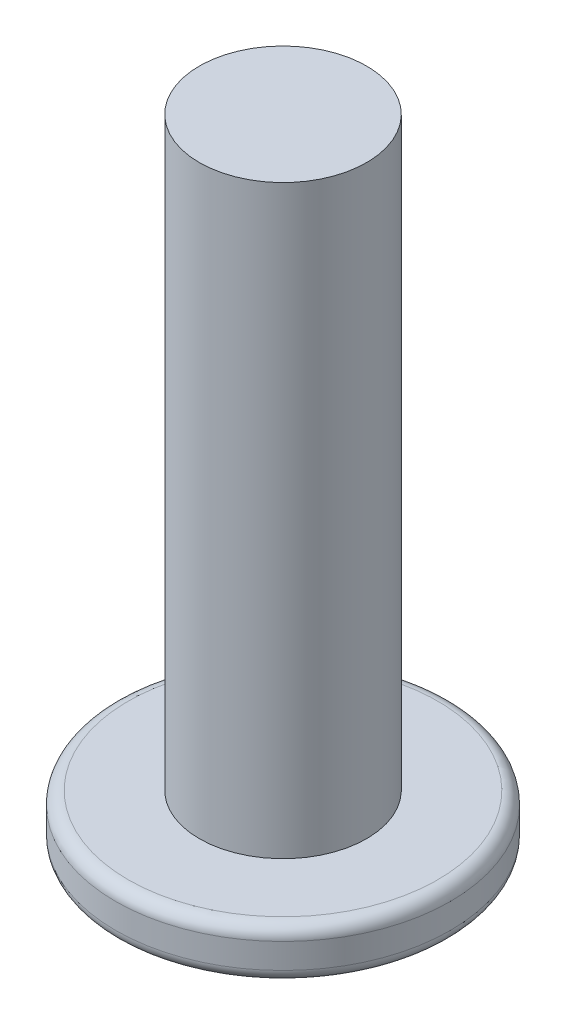
ISO-10303-21;
HEADER;
FILE_DESCRIPTION(('STEP AP214'),'2;1');
FILE_NAME('part.step','',(''),(''),'','','');
FILE_SCHEMA(('AUTOMOTIVE_DESIGN { 1 0 10303 214 1 1 1 1 }'));
ENDSEC;
DATA;
#1=APPLICATION_CONTEXT('core data for automotive mechanical design processes');
#2=APPLICATION_PROTOCOL_DEFINITION('international standard','automotive_design',2000,#1);
#3=PRODUCT_CONTEXT('',#1,'mechanical');
#4=PRODUCT('Part','Part','',(#3));
#5=PRODUCT_RELATED_PRODUCT_CATEGORY('part','',(#4));
#6=PRODUCT_DEFINITION_FORMATION('','',#4);
#7=PRODUCT_DEFINITION_CONTEXT('part definition',#1,'design');
#8=PRODUCT_DEFINITION('design','',#6,#7);
#9=PRODUCT_DEFINITION_SHAPE('','',#8);
#10=(LENGTH_UNIT() NAMED_UNIT(*) SI_UNIT(.MILLI.,.METRE.));
#11=(NAMED_UNIT(*) PLANE_ANGLE_UNIT() SI_UNIT($,.RADIAN.));
#12=(NAMED_UNIT(*) SI_UNIT($,.STERADIAN.) SOLID_ANGLE_UNIT());
#13=UNCERTAINTY_MEASURE_WITH_UNIT(LENGTH_MEASURE(1.E-05),#10,'distance_accuracy_value','');
#14=(GEOMETRIC_REPRESENTATION_CONTEXT(3) GLOBAL_UNCERTAINTY_ASSIGNED_CONTEXT((#13)) GLOBAL_UNIT_ASSIGNED_CONTEXT((#10,
#11,#12)) REPRESENTATION_CONTEXT('',''));
#15=CARTESIAN_POINT('',(0.,0.,0.));
#16=DIRECTION('',(0.,0.,1.));
#17=DIRECTION('',(1.,0.,0.));
#18=AXIS2_PLACEMENT_3D('',#15,#16,#17);
#19=CARTESIAN_POINT('',(0.,1.2,0.));
#20=DIRECTION('',(0.,-1.,0.));
#21=DIRECTION('',(0.,0.,-1.));
#22=AXIS2_PLACEMENT_3D('',#19,#20,#21);
#23=CYLINDRICAL_SURFACE('',#22,4.);
#24=CARTESIAN_POINT('',(0.,0.3,0.));
#25=DIRECTION('',(0.,1.,0.));
#26=DIRECTION('',(0.,0.,1.));
#27=AXIS2_PLACEMENT_3D('',#24,#25,#26);
#28=CIRCLE('',#27,4.);
#29=CARTESIAN_POINT('',(0.,0.3,4.));
#30=VERTEX_POINT('',#29);
#31=EDGE_CURVE('E151',#30,#30,#28,.T.);
#32=ORIENTED_EDGE('',*,*,#31,.T.);
#33=EDGE_LOOP('',(#32));
#34=FACE_BOUND('',#33,.T.);
#35=CARTESIAN_POINT('',(0.,0.9,0.));
#36=DIRECTION('',(0.,1.,0.));
#37=DIRECTION('',(0.,0.,1.));
#38=AXIS2_PLACEMENT_3D('',#35,#36,#37);
#39=CIRCLE('',#38,4.);
#40=CARTESIAN_POINT('',(0.,0.9,4.));
#41=VERTEX_POINT('',#40);
#42=EDGE_CURVE('E148',#41,#41,#39,.F.);
#43=ORIENTED_EDGE('',*,*,#42,.T.);
#44=EDGE_LOOP('',(#43));
#45=FACE_BOUND('',#44,.T.);
#46=ADVANCED_FACE('F35',(#34,#45),#23,.T.);
#47=CARTESIAN_POINT('',(0.,1.2,0.));
#48=DIRECTION('',(0.,1.,0.));
#49=DIRECTION('',(0.,0.,1.));
#50=AXIS2_PLACEMENT_3D('',#47,#48,#49);
#51=PLANE('',#50);
#52=CARTESIAN_POINT('',(0.,1.2,0.));
#53=DIRECTION('',(0.,1.,0.));
#54=DIRECTION('',(0.,0.,1.));
#55=AXIS2_PLACEMENT_3D('',#52,#53,#54);
#56=CIRCLE('',#55,3.7);
#57=CARTESIAN_POINT('',(0.,1.2,3.7));
#58=VERTEX_POINT('',#57);
#59=EDGE_CURVE('E11',#58,#58,#56,.T.);
#60=ORIENTED_EDGE('',*,*,#59,.T.);
#61=EDGE_LOOP('',(#60));
#62=FACE_BOUND('',#61,.T.);
#63=CARTESIAN_POINT('',(0.,1.2,0.));
#64=DIRECTION('',(0.,1.,0.));
#65=DIRECTION('',(0.,0.,1.));
#66=AXIS2_PLACEMENT_3D('',#63,#64,#65);
#67=CIRCLE('',#66,2.);
#68=CARTESIAN_POINT('',(0.,1.2,2.));
#69=VERTEX_POINT('',#68);
#70=EDGE_CURVE('E145',#69,#69,#67,.T.);
#71=ORIENTED_EDGE('',*,*,#70,.F.);
#72=EDGE_LOOP('',(#71));
#73=FACE_BOUND('',#72,.T.);
#74=ADVANCED_FACE('F166',(#62,#73),#51,.T.);
#75=CARTESIAN_POINT('',(0.,0.,0.));
#76=DIRECTION('',(0.,1.,0.));
#77=DIRECTION('',(0.,0.,1.));
#78=AXIS2_PLACEMENT_3D('',#75,#76,#77);
#79=PLANE('',#78);
#80=DIRECTION('',(-0.5,0.,0.866025403784439));
#81=VECTOR('',#80,1.);
#82=CARTESIAN_POINT('',(1.73205080756888,0.,0.));
#83=LINE('',#82,#81);
#84=CARTESIAN_POINT('',(1.73205080756888,0.,0.));
#85=VERTEX_POINT('',#84);
#86=CARTESIAN_POINT('',(0.866025403784437,0.,1.5));
#87=VERTEX_POINT('',#86);
#88=EDGE_CURVE('E124',#85,#87,#83,.T.);
#89=ORIENTED_EDGE('',*,*,#88,.F.);
#90=DIRECTION('',(0.5,0.,0.866025403784439));
#91=VECTOR('',#90,1.);
#92=CARTESIAN_POINT('',(0.866025403784438,0.,-1.5));
#93=LINE('',#92,#91);
#94=CARTESIAN_POINT('',(0.866025403784438,0.,-1.5));
#95=VERTEX_POINT('',#94);
#96=EDGE_CURVE('E50',#95,#85,#93,.T.);
#97=ORIENTED_EDGE('',*,*,#96,.F.);
#98=DIRECTION('',(1.,0.,0.));
#99=VECTOR('',#98,1.);
#100=CARTESIAN_POINT('',(-0.866025403784439,0.,-1.5));
#101=LINE('',#100,#99);
#102=CARTESIAN_POINT('',(-0.866025403784439,0.,-1.5));
#103=VERTEX_POINT('',#102);
#104=EDGE_CURVE('E133',#103,#95,#101,.T.);
#105=ORIENTED_EDGE('',*,*,#104,.F.);
#106=DIRECTION('',(0.5,0.,-0.866025403784439));
#107=VECTOR('',#106,1.);
#108=CARTESIAN_POINT('',(-1.73205080756888,0.,0.));
#109=LINE('',#108,#107);
#110=CARTESIAN_POINT('',(-1.73205080756888,0.,0.));
#111=VERTEX_POINT('',#110);
#112=EDGE_CURVE('E131',#111,#103,#109,.T.);
#113=ORIENTED_EDGE('',*,*,#112,.F.);
#114=DIRECTION('',(-0.5,0.,-0.866025403784439));
#115=VECTOR('',#114,1.);
#116=CARTESIAN_POINT('',(-0.866025403784439,0.,1.5));
#117=LINE('',#116,#115);
#118=CARTESIAN_POINT('',(-0.866025403784439,0.,1.5));
#119=VERTEX_POINT('',#118);
#120=EDGE_CURVE('E98',#119,#111,#117,.T.);
#121=ORIENTED_EDGE('',*,*,#120,.F.);
#122=DIRECTION('',(-1.,0.,0.));
#123=VECTOR('',#122,1.);
#124=CARTESIAN_POINT('',(0.866025403784437,0.,1.5));
#125=LINE('',#124,#123);
#126=EDGE_CURVE('E127',#87,#119,#125,.T.);
#127=ORIENTED_EDGE('',*,*,#126,.F.);
#128=EDGE_LOOP('',(#89,#97,#105,#113,#121,#127));
#129=FACE_BOUND('',#128,.T.);
#130=CARTESIAN_POINT('',(0.,0.,0.));
#131=DIRECTION('',(0.,1.,0.));
#132=DIRECTION('',(0.,0.,1.));
#133=AXIS2_PLACEMENT_3D('',#130,#131,#132);
#134=CIRCLE('',#133,3.7);
#135=CARTESIAN_POINT('',(0.,0.,3.7));
#136=VERTEX_POINT('',#135);
#137=EDGE_CURVE('E43',#136,#136,#134,.F.);
#138=ORIENTED_EDGE('',*,*,#137,.T.);
#139=EDGE_LOOP('',(#138));
#140=FACE_BOUND('',#139,.T.);
#141=ADVANCED_FACE('F156',(#129,#140),#79,.F.);
#142=CARTESIAN_POINT('',(0.,15.2,0.));
#143=DIRECTION('',(0.,-1.,0.));
#144=DIRECTION('',(0.,0.,-1.));
#145=AXIS2_PLACEMENT_3D('',#142,#143,#144);
#146=CYLINDRICAL_SURFACE('',#145,2.);
#147=CARTESIAN_POINT('',(0.,15.2,0.));
#148=DIRECTION('',(0.,1.,0.));
#149=DIRECTION('',(0.,0.,1.));
#150=AXIS2_PLACEMENT_3D('',#147,#148,#149);
#151=CIRCLE('',#150,2.);
#152=CARTESIAN_POINT('',(0.,15.2,2.));
#153=VERTEX_POINT('',#152);
#154=EDGE_CURVE('E137',#153,#153,#151,.T.);
#155=ORIENTED_EDGE('',*,*,#154,.F.);
#156=EDGE_LOOP('',(#155));
#157=FACE_BOUND('',#156,.T.);
#158=ORIENTED_EDGE('',*,*,#70,.T.);
#159=EDGE_LOOP('',(#158));
#160=FACE_BOUND('',#159,.T.);
#161=ADVANCED_FACE('F180',(#157,#160),#146,.T.);
#162=CARTESIAN_POINT('',(0.,15.2,0.));
#163=DIRECTION('',(0.,1.,0.));
#164=DIRECTION('',(0.,0.,1.));
#165=AXIS2_PLACEMENT_3D('',#162,#163,#164);
#166=PLANE('',#165);
#167=ORIENTED_EDGE('',*,*,#154,.T.);
#168=EDGE_LOOP('',(#167));
#169=FACE_BOUND('',#168,.T.);
#170=ADVANCED_FACE('F161',(#169),#166,.T.);
#171=CARTESIAN_POINT('',(0.,0.3,0.));
#172=DIRECTION('',(0.,1.,0.));
#173=DIRECTION('',(0.,0.,1.));
#174=AXIS2_PLACEMENT_3D('',#171,#172,#173);
#175=TOROIDAL_SURFACE('',#174,3.7,0.3);
#176=ORIENTED_EDGE('',*,*,#137,.F.);
#177=EDGE_LOOP('',(#176));
#178=FACE_BOUND('',#177,.T.);
#179=ORIENTED_EDGE('',*,*,#31,.F.);
#180=EDGE_LOOP('',(#179));
#181=FACE_BOUND('',#180,.T.);
#182=ADVANCED_FACE('F158',(#178,#181),#175,.T.);
#183=CARTESIAN_POINT('',(0.,0.9,0.));
#184=DIRECTION('',(0.,1.,0.));
#185=DIRECTION('',(0.,0.,1.));
#186=AXIS2_PLACEMENT_3D('',#183,#184,#185);
#187=TOROIDAL_SURFACE('',#186,3.7,0.3);
#188=ORIENTED_EDGE('',*,*,#42,.F.);
#189=EDGE_LOOP('',(#188));
#190=FACE_BOUND('',#189,.T.);
#191=ORIENTED_EDGE('',*,*,#59,.F.);
#192=EDGE_LOOP('',(#191));
#193=FACE_BOUND('',#192,.T.);
#194=ADVANCED_FACE('F37',(#190,#193),#187,.T.);
#195=CARTESIAN_POINT('',(0.866025403784438,0.6,-1.5));
#196=DIRECTION('',(0.866025403784439,0.,-0.5));
#197=DIRECTION('',(-0.5,0.,-0.866025403784439));
#198=AXIS2_PLACEMENT_3D('',#195,#196,#197);
#199=PLANE('',#198);
#200=ORIENTED_EDGE('',*,*,#96,.T.);
#201=DIRECTION('',(0.,-1.,0.));
#202=VECTOR('',#201,1.);
#203=CARTESIAN_POINT('',(1.73205080756888,0.6,0.));
#204=LINE('',#203,#202);
#205=CARTESIAN_POINT('',(1.73205080756888,0.6,0.));
#206=VERTEX_POINT('',#205);
#207=EDGE_CURVE('E80',#206,#85,#204,.T.);
#208=ORIENTED_EDGE('',*,*,#207,.F.);
#209=DIRECTION('',(0.5,0.,0.866025403784439));
#210=VECTOR('',#209,1.);
#211=CARTESIAN_POINT('',(0.866025403784438,0.6,-1.5));
#212=LINE('',#211,#210);
#213=CARTESIAN_POINT('',(0.866025403784438,0.6,-1.5));
#214=VERTEX_POINT('',#213);
#215=EDGE_CURVE('E135',#214,#206,#212,.T.);
#216=ORIENTED_EDGE('',*,*,#215,.F.);
#217=DIRECTION('',(0.,-1.,0.));
#218=VECTOR('',#217,1.);
#219=CARTESIAN_POINT('',(0.866025403784438,0.6,-1.5));
#220=LINE('',#219,#218);
#221=EDGE_CURVE('E58',#214,#95,#220,.T.);
#222=ORIENTED_EDGE('',*,*,#221,.T.);
#223=EDGE_LOOP('',(#200,#208,#216,#222));
#224=FACE_BOUND('',#223,.T.);
#225=ADVANCED_FACE('F172',(#224),#199,.F.);
#226=CARTESIAN_POINT('',(-0.866025403784439,0.6,-1.5));
#227=DIRECTION('',(0.,0.,-1.));
#228=DIRECTION('',(-1.,0.,0.));
#229=AXIS2_PLACEMENT_3D('',#226,#227,#228);
#230=PLANE('',#229);
#231=ORIENTED_EDGE('',*,*,#104,.T.);
#232=ORIENTED_EDGE('',*,*,#221,.F.);
#233=DIRECTION('',(1.,0.,0.));
#234=VECTOR('',#233,1.);
#235=CARTESIAN_POINT('',(-0.866025403784439,0.6,-1.5));
#236=LINE('',#235,#234);
#237=CARTESIAN_POINT('',(-0.866025403784439,0.6,-1.5));
#238=VERTEX_POINT('',#237);
#239=EDGE_CURVE('E110',#238,#214,#236,.T.);
#240=ORIENTED_EDGE('',*,*,#239,.F.);
#241=DIRECTION('',(0.,-1.,0.));
#242=VECTOR('',#241,1.);
#243=CARTESIAN_POINT('',(-0.866025403784439,0.6,-1.5));
#244=LINE('',#243,#242);
#245=EDGE_CURVE('E102',#238,#103,#244,.T.);
#246=ORIENTED_EDGE('',*,*,#245,.T.);
#247=EDGE_LOOP('',(#231,#232,#240,#246));
#248=FACE_BOUND('',#247,.T.);
#249=ADVANCED_FACE('F196',(#248),#230,.F.);
#250=CARTESIAN_POINT('',(-1.73205080756888,0.6,0.));
#251=DIRECTION('',(-0.866025403784439,0.,-0.5));
#252=DIRECTION('',(-0.5,0.,0.866025403784439));
#253=AXIS2_PLACEMENT_3D('',#250,#251,#252);
#254=PLANE('',#253);
#255=ORIENTED_EDGE('',*,*,#112,.T.);
#256=ORIENTED_EDGE('',*,*,#245,.F.);
#257=DIRECTION('',(0.5,0.,-0.866025403784439));
#258=VECTOR('',#257,1.);
#259=CARTESIAN_POINT('',(-1.73205080756888,0.6,0.));
#260=LINE('',#259,#258);
#261=CARTESIAN_POINT('',(-1.73205080756888,0.6,0.));
#262=VERTEX_POINT('',#261);
#263=EDGE_CURVE('E106',#262,#238,#260,.T.);
#264=ORIENTED_EDGE('',*,*,#263,.F.);
#265=DIRECTION('',(0.,-1.,0.));
#266=VECTOR('',#265,1.);
#267=CARTESIAN_POINT('',(-1.73205080756888,0.6,0.));
#268=LINE('',#267,#266);
#269=EDGE_CURVE('E91',#262,#111,#268,.T.);
#270=ORIENTED_EDGE('',*,*,#269,.T.);
#271=EDGE_LOOP('',(#255,#256,#264,#270));
#272=FACE_BOUND('',#271,.T.);
#273=ADVANCED_FACE('F107',(#272),#254,.F.);
#274=CARTESIAN_POINT('',(-0.866025403784439,0.6,1.5));
#275=DIRECTION('',(-0.866025403784439,0.,0.5));
#276=DIRECTION('',(0.5,0.,0.866025403784439));
#277=AXIS2_PLACEMENT_3D('',#274,#275,#276);
#278=PLANE('',#277);
#279=ORIENTED_EDGE('',*,*,#120,.T.);
#280=ORIENTED_EDGE('',*,*,#269,.F.);
#281=DIRECTION('',(-0.5,0.,-0.866025403784439));
#282=VECTOR('',#281,1.);
#283=CARTESIAN_POINT('',(-0.866025403784439,0.6,1.5));
#284=LINE('',#283,#282);
#285=CARTESIAN_POINT('',(-0.866025403784439,0.6,1.5));
#286=VERTEX_POINT('',#285);
#287=EDGE_CURVE('E95',#286,#262,#284,.T.);
#288=ORIENTED_EDGE('',*,*,#287,.F.);
#289=DIRECTION('',(0.,-1.,0.));
#290=VECTOR('',#289,1.);
#291=CARTESIAN_POINT('',(-0.866025403784439,0.6,1.5));
#292=LINE('',#291,#290);
#293=EDGE_CURVE('E103',#286,#119,#292,.T.);
#294=ORIENTED_EDGE('',*,*,#293,.T.);
#295=EDGE_LOOP('',(#279,#280,#288,#294));
#296=FACE_BOUND('',#295,.T.);
#297=ADVANCED_FACE('F93',(#296),#278,.F.);
#298=CARTESIAN_POINT('',(0.866025403784437,0.6,1.5));
#299=DIRECTION('',(0.,0.,1.));
#300=DIRECTION('',(1.,0.,0.));
#301=AXIS2_PLACEMENT_3D('',#298,#299,#300);
#302=PLANE('',#301);
#303=ORIENTED_EDGE('',*,*,#126,.T.);
#304=ORIENTED_EDGE('',*,*,#293,.F.);
#305=DIRECTION('',(-1.,0.,0.));
#306=VECTOR('',#305,1.);
#307=CARTESIAN_POINT('',(0.866025403784437,0.6,1.5));
#308=LINE('',#307,#306);
#309=CARTESIAN_POINT('',(0.866025403784437,0.6,1.5));
#310=VERTEX_POINT('',#309);
#311=EDGE_CURVE('E116',#310,#286,#308,.T.);
#312=ORIENTED_EDGE('',*,*,#311,.F.);
#313=DIRECTION('',(0.,-1.,0.));
#314=VECTOR('',#313,1.);
#315=CARTESIAN_POINT('',(0.866025403784437,0.6,1.5));
#316=LINE('',#315,#314);
#317=EDGE_CURVE('E140',#310,#87,#316,.T.);
#318=ORIENTED_EDGE('',*,*,#317,.T.);
#319=EDGE_LOOP('',(#303,#304,#312,#318));
#320=FACE_BOUND('',#319,.T.);
#321=ADVANCED_FACE('F200',(#320),#302,.F.);
#322=CARTESIAN_POINT('',(1.73205080756888,0.6,0.));
#323=DIRECTION('',(0.866025403784439,0.,0.5));
#324=DIRECTION('',(0.5,0.,-0.866025403784439));
#325=AXIS2_PLACEMENT_3D('',#322,#323,#324);
#326=PLANE('',#325);
#327=ORIENTED_EDGE('',*,*,#88,.T.);
#328=ORIENTED_EDGE('',*,*,#317,.F.);
#329=DIRECTION('',(-0.5,0.,0.866025403784439));
#330=VECTOR('',#329,1.);
#331=CARTESIAN_POINT('',(1.73205080756888,0.6,0.));
#332=LINE('',#331,#330);
#333=EDGE_CURVE('E118',#206,#310,#332,.T.);
#334=ORIENTED_EDGE('',*,*,#333,.F.);
#335=ORIENTED_EDGE('',*,*,#207,.T.);
#336=EDGE_LOOP('',(#327,#328,#334,#335));
#337=FACE_BOUND('',#336,.T.);
#338=ADVANCED_FACE('F197',(#337),#326,.F.);
#339=CARTESIAN_POINT('',(0.,0.6,0.));
#340=DIRECTION('',(0.,-1.,0.));
#341=DIRECTION('',(0.,0.,-1.));
#342=AXIS2_PLACEMENT_3D('',#339,#340,#341);
#343=PLANE('',#342);
#344=ORIENTED_EDGE('',*,*,#215,.T.);
#345=ORIENTED_EDGE('',*,*,#333,.T.);
#346=ORIENTED_EDGE('',*,*,#311,.T.);
#347=ORIENTED_EDGE('',*,*,#287,.T.);
#348=ORIENTED_EDGE('',*,*,#263,.T.);
#349=ORIENTED_EDGE('',*,*,#239,.T.);
#350=EDGE_LOOP('',(#344,#345,#346,#347,#348,#349));
#351=FACE_BOUND('',#350,.T.);
#352=ADVANCED_FACE('F113',(#351),#343,.T.);
#353=CLOSED_SHELL('',(#46,#74,#141,#161,#170,#182,#194,#225,#249,#273,#297,#321,#338,#352));
#354=MANIFOLD_SOLID_BREP('B2',#353);
#355=ADVANCED_BREP_SHAPE_REPRESENTATION('',(#18,#354),#14);
#356=SHAPE_DEFINITION_REPRESENTATION(#9,#355);
ENDSEC;
END-ISO-10303-21;
